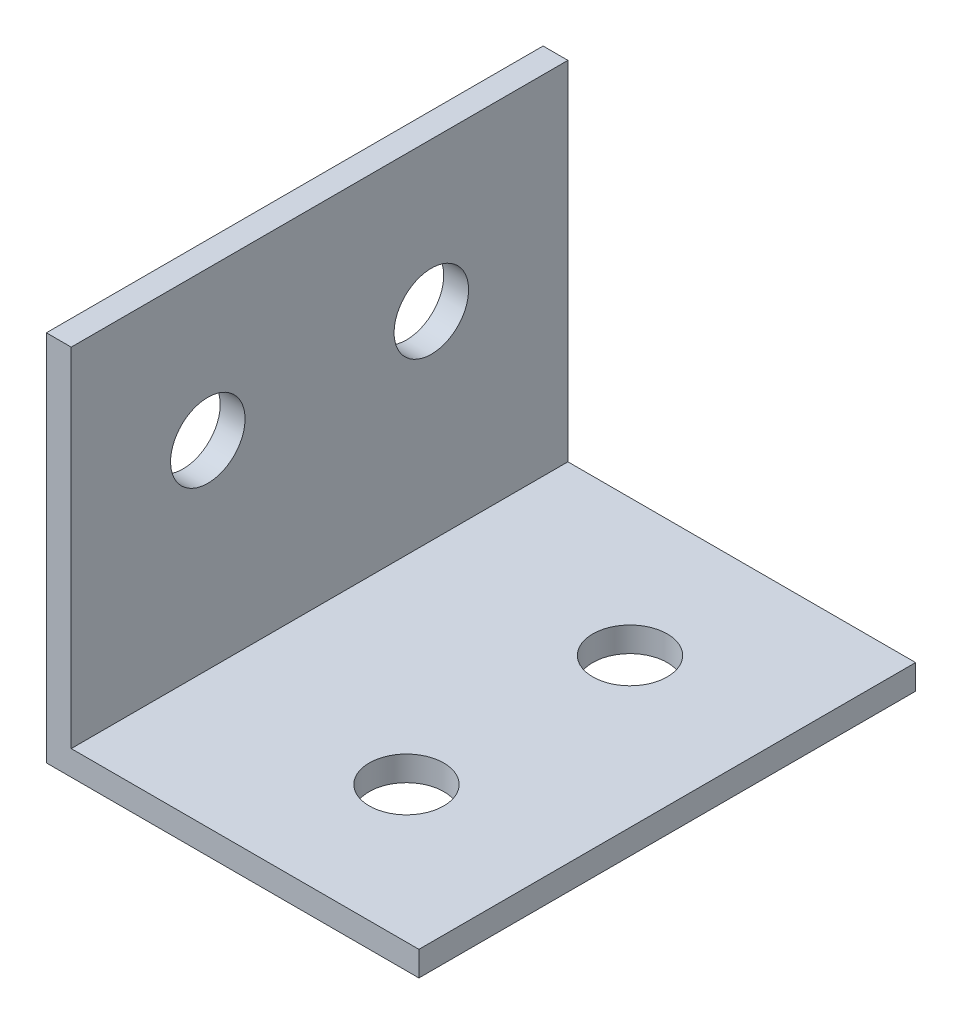
ISO-10303-21;
HEADER;
FILE_DESCRIPTION(('STEP AP214'),'2;1');
FILE_NAME('part.step','',(''),(''),'','','');
FILE_SCHEMA(('AUTOMOTIVE_DESIGN { 1 0 10303 214 1 1 1 1 }'));
ENDSEC;
DATA;
#1=APPLICATION_CONTEXT('core data for automotive mechanical design processes');
#2=APPLICATION_PROTOCOL_DEFINITION('international standard','automotive_design',2000,#1);
#3=PRODUCT_CONTEXT('',#1,'mechanical');
#4=PRODUCT('Part','Part','',(#3));
#5=PRODUCT_RELATED_PRODUCT_CATEGORY('part','',(#4));
#6=PRODUCT_DEFINITION_FORMATION('','',#4);
#7=PRODUCT_DEFINITION_CONTEXT('part definition',#1,'design');
#8=PRODUCT_DEFINITION('design','',#6,#7);
#9=PRODUCT_DEFINITION_SHAPE('','',#8);
#10=(LENGTH_UNIT() NAMED_UNIT(*) SI_UNIT(.MILLI.,.METRE.));
#11=(NAMED_UNIT(*) PLANE_ANGLE_UNIT() SI_UNIT($,.RADIAN.));
#12=(NAMED_UNIT(*) SI_UNIT($,.STERADIAN.) SOLID_ANGLE_UNIT());
#13=UNCERTAINTY_MEASURE_WITH_UNIT(LENGTH_MEASURE(1.E-05),#10,'distance_accuracy_value','');
#14=(GEOMETRIC_REPRESENTATION_CONTEXT(3) GLOBAL_UNCERTAINTY_ASSIGNED_CONTEXT((#13)) GLOBAL_UNIT_ASSIGNED_CONTEXT((#10,
#11,#12)) REPRESENTATION_CONTEXT('',''));
#15=CARTESIAN_POINT('',(0.,0.,0.));
#16=DIRECTION('',(0.,0.,1.));
#17=DIRECTION('',(1.,0.,0.));
#18=AXIS2_PLACEMENT_3D('',#15,#16,#17);
#19=CARTESIAN_POINT('',(14.,0.,20.));
#20=DIRECTION('',(0.,-1.,0.));
#21=DIRECTION('',(1.,0.,0.));
#22=AXIS2_PLACEMENT_3D('',#19,#20,#21);
#23=PLANE('',#22);
#24=CARTESIAN_POINT('',(8.00000000000001,0.,5.5));
#25=DIRECTION('',(0.,1.,0.));
#26=DIRECTION('',(-1.,0.,0.));
#27=AXIS2_PLACEMENT_3D('',#24,#25,#26);
#28=CIRCLE('',#27,1.5);
#29=CARTESIAN_POINT('',(6.50000000000001,0.,5.5));
#30=VERTEX_POINT('',#29);
#31=EDGE_CURVE('E183',#30,#30,#28,.T.);
#32=ORIENTED_EDGE('',*,*,#31,.F.);
#33=EDGE_LOOP('',(#32));
#34=FACE_BOUND('',#33,.T.);
#35=CARTESIAN_POINT('',(8.00000000000001,0.,14.5));
#36=DIRECTION('',(0.,1.,0.));
#37=DIRECTION('',(1.,0.,0.));
#38=AXIS2_PLACEMENT_3D('',#35,#36,#37);
#39=CIRCLE('',#38,1.5);
#40=CARTESIAN_POINT('',(9.5,0.,14.5));
#41=VERTEX_POINT('',#40);
#42=EDGE_CURVE('E186',#41,#41,#39,.T.);
#43=ORIENTED_EDGE('',*,*,#42,.F.);
#44=EDGE_LOOP('',(#43));
#45=FACE_BOUND('',#44,.T.);
#46=DIRECTION('',(-1.,0.,0.));
#47=VECTOR('',#46,1.);
#48=CARTESIAN_POINT('',(14.,0.,0.));
#49=LINE('',#48,#47);
#50=CARTESIAN_POINT('',(14.,0.,0.));
#51=VERTEX_POINT('',#50);
#52=CARTESIAN_POINT('',(0.,0.,0.));
#53=VERTEX_POINT('',#52);
#54=EDGE_CURVE('E128',#51,#53,#49,.T.);
#55=ORIENTED_EDGE('',*,*,#54,.T.);
#56=DIRECTION('',(0.,0.,-1.));
#57=VECTOR('',#56,1.);
#58=CARTESIAN_POINT('',(0.,0.,20.));
#59=LINE('',#58,#57);
#60=CARTESIAN_POINT('',(0.,0.,20.));
#61=VERTEX_POINT('',#60);
#62=EDGE_CURVE('E11',#61,#53,#59,.T.);
#63=ORIENTED_EDGE('',*,*,#62,.F.);
#64=DIRECTION('',(-1.,0.,0.));
#65=VECTOR('',#64,1.);
#66=CARTESIAN_POINT('',(14.,0.,20.));
#67=LINE('',#66,#65);
#68=CARTESIAN_POINT('',(14.,0.,20.));
#69=VERTEX_POINT('',#68);
#70=EDGE_CURVE('E145',#69,#61,#67,.T.);
#71=ORIENTED_EDGE('',*,*,#70,.F.);
#72=DIRECTION('',(0.,0.,-1.));
#73=VECTOR('',#72,1.);
#74=CARTESIAN_POINT('',(14.,0.,20.));
#75=LINE('',#74,#73);
#76=EDGE_CURVE('E124',#69,#51,#75,.T.);
#77=ORIENTED_EDGE('',*,*,#76,.T.);
#78=EDGE_LOOP('',(#55,#63,#71,#77));
#79=FACE_BOUND('',#78,.T.);
#80=ADVANCED_FACE('F39',(#34,#45,#79),#23,.F.);
#81=CARTESIAN_POINT('',(0.,0.,20.));
#82=DIRECTION('',(-1.,0.,0.));
#83=DIRECTION('',(0.,-1.,0.));
#84=AXIS2_PLACEMENT_3D('',#81,#82,#83);
#85=PLANE('',#84);
#86=CARTESIAN_POINT('',(0.,8.00000000000001,5.5));
#87=DIRECTION('',(-1.,0.,0.));
#88=DIRECTION('',(0.,-1.,0.));
#89=AXIS2_PLACEMENT_3D('',#86,#87,#88);
#90=CIRCLE('',#89,1.5);
#91=CARTESIAN_POINT('',(0.,6.50000000000001,5.5));
#92=VERTEX_POINT('',#91);
#93=EDGE_CURVE('E197',#92,#92,#90,.T.);
#94=ORIENTED_EDGE('',*,*,#93,.T.);
#95=EDGE_LOOP('',(#94));
#96=FACE_BOUND('',#95,.T.);
#97=CARTESIAN_POINT('',(0.,8.00000000000001,14.5));
#98=DIRECTION('',(-1.,0.,0.));
#99=DIRECTION('',(0.,1.,0.));
#100=AXIS2_PLACEMENT_3D('',#97,#98,#99);
#101=CIRCLE('',#100,1.5);
#102=CARTESIAN_POINT('',(0.,9.5,14.5));
#103=VERTEX_POINT('',#102);
#104=EDGE_CURVE('E211',#103,#103,#101,.T.);
#105=ORIENTED_EDGE('',*,*,#104,.T.);
#106=EDGE_LOOP('',(#105));
#107=FACE_BOUND('',#106,.T.);
#108=DIRECTION('',(0.,1.,0.));
#109=VECTOR('',#108,1.);
#110=CARTESIAN_POINT('',(0.,0.,0.));
#111=LINE('',#110,#109);
#112=CARTESIAN_POINT('',(0.,14.,0.));
#113=VERTEX_POINT('',#112);
#114=EDGE_CURVE('E132',#53,#113,#111,.T.);
#115=ORIENTED_EDGE('',*,*,#114,.T.);
#116=DIRECTION('',(0.,0.,-1.));
#117=VECTOR('',#116,1.);
#118=CARTESIAN_POINT('',(0.,14.,20.));
#119=LINE('',#118,#117);
#120=CARTESIAN_POINT('',(0.,14.,20.));
#121=VERTEX_POINT('',#120);
#122=EDGE_CURVE('E48',#121,#113,#119,.T.);
#123=ORIENTED_EDGE('',*,*,#122,.F.);
#124=DIRECTION('',(0.,1.,0.));
#125=VECTOR('',#124,1.);
#126=CARTESIAN_POINT('',(0.,0.,20.));
#127=LINE('',#126,#125);
#128=EDGE_CURVE('E93',#61,#121,#127,.T.);
#129=ORIENTED_EDGE('',*,*,#128,.F.);
#130=ORIENTED_EDGE('',*,*,#62,.T.);
#131=EDGE_LOOP('',(#115,#123,#129,#130));
#132=FACE_BOUND('',#131,.T.);
#133=ADVANCED_FACE('F174',(#96,#107,#132),#85,.F.);
#134=CARTESIAN_POINT('',(0.,14.,20.));
#135=DIRECTION('',(0.,-1.,0.));
#136=DIRECTION('',(1.,0.,0.));
#137=AXIS2_PLACEMENT_3D('',#134,#135,#136);
#138=PLANE('',#137);
#139=DIRECTION('',(-1.,0.,0.));
#140=VECTOR('',#139,1.);
#141=CARTESIAN_POINT('',(0.,14.,0.));
#142=LINE('',#141,#140);
#143=CARTESIAN_POINT('',(-0.999999999999999,14.,0.));
#144=VERTEX_POINT('',#143);
#145=EDGE_CURVE('E136',#113,#144,#142,.T.);
#146=ORIENTED_EDGE('',*,*,#145,.T.);
#147=DIRECTION('',(0.,0.,-1.));
#148=VECTOR('',#147,1.);
#149=CARTESIAN_POINT('',(-0.999999999999999,14.,20.));
#150=LINE('',#149,#148);
#151=CARTESIAN_POINT('',(-0.999999999999999,14.,20.));
#152=VERTEX_POINT('',#151);
#153=EDGE_CURVE('E117',#152,#144,#150,.T.);
#154=ORIENTED_EDGE('',*,*,#153,.F.);
#155=DIRECTION('',(-1.,0.,0.));
#156=VECTOR('',#155,1.);
#157=CARTESIAN_POINT('',(0.,14.,20.));
#158=LINE('',#157,#156);
#159=EDGE_CURVE('E106',#121,#152,#158,.T.);
#160=ORIENTED_EDGE('',*,*,#159,.F.);
#161=ORIENTED_EDGE('',*,*,#122,.T.);
#162=EDGE_LOOP('',(#146,#154,#160,#161));
#163=FACE_BOUND('',#162,.T.);
#164=ADVANCED_FACE('F155',(#163),#138,.F.);
#165=CARTESIAN_POINT('',(-0.999999999999999,14.,20.));
#166=DIRECTION('',(1.,0.,0.));
#167=DIRECTION('',(0.,1.,0.));
#168=AXIS2_PLACEMENT_3D('',#165,#166,#167);
#169=PLANE('',#168);
#170=CARTESIAN_POINT('',(-1.,8.00000000000001,5.5));
#171=DIRECTION('',(-1.,0.,0.));
#172=DIRECTION('',(0.,-1.,0.));
#173=AXIS2_PLACEMENT_3D('',#170,#171,#172);
#174=CIRCLE('',#173,1.5);
#175=CARTESIAN_POINT('',(-1.,6.50000000000001,5.5));
#176=VERTEX_POINT('',#175);
#177=EDGE_CURVE('E190',#176,#176,#174,.T.);
#178=ORIENTED_EDGE('',*,*,#177,.F.);
#179=EDGE_LOOP('',(#178));
#180=FACE_BOUND('',#179,.T.);
#181=CARTESIAN_POINT('',(-1.,8.00000000000001,14.5));
#182=DIRECTION('',(-1.,0.,0.));
#183=DIRECTION('',(0.,1.,0.));
#184=AXIS2_PLACEMENT_3D('',#181,#182,#183);
#185=CIRCLE('',#184,1.5);
#186=CARTESIAN_POINT('',(-1.,9.5,14.5));
#187=VERTEX_POINT('',#186);
#188=EDGE_CURVE('E215',#187,#187,#185,.T.);
#189=ORIENTED_EDGE('',*,*,#188,.F.);
#190=EDGE_LOOP('',(#189));
#191=FACE_BOUND('',#190,.T.);
#192=DIRECTION('',(0.,-1.,0.));
#193=VECTOR('',#192,1.);
#194=CARTESIAN_POINT('',(-0.999999999999999,14.,0.));
#195=LINE('',#194,#193);
#196=CARTESIAN_POINT('',(-1.,-0.999999999999998,0.));
#197=VERTEX_POINT('',#196);
#198=EDGE_CURVE('E115',#144,#197,#195,.T.);
#199=ORIENTED_EDGE('',*,*,#198,.T.);
#200=DIRECTION('',(0.,0.,-1.));
#201=VECTOR('',#200,1.);
#202=CARTESIAN_POINT('',(-1.,-0.999999999999998,20.));
#203=LINE('',#202,#201);
#204=CARTESIAN_POINT('',(-1.,-0.999999999999998,20.));
#205=VERTEX_POINT('',#204);
#206=EDGE_CURVE('E112',#205,#197,#203,.T.);
#207=ORIENTED_EDGE('',*,*,#206,.F.);
#208=DIRECTION('',(0.,-1.,0.));
#209=VECTOR('',#208,1.);
#210=CARTESIAN_POINT('',(-0.999999999999999,14.,20.));
#211=LINE('',#210,#209);
#212=EDGE_CURVE('E100',#152,#205,#211,.T.);
#213=ORIENTED_EDGE('',*,*,#212,.F.);
#214=ORIENTED_EDGE('',*,*,#153,.T.);
#215=EDGE_LOOP('',(#199,#207,#213,#214));
#216=FACE_BOUND('',#215,.T.);
#217=ADVANCED_FACE('F113',(#180,#191,#216),#169,.F.);
#218=CARTESIAN_POINT('',(-1.,-0.999999999999998,20.));
#219=DIRECTION('',(0.,1.,0.));
#220=DIRECTION('',(0.,0.,1.));
#221=AXIS2_PLACEMENT_3D('',#218,#219,#220);
#222=PLANE('',#221);
#223=CARTESIAN_POINT('',(8.00000000000001,-0.999999999999999,5.5));
#224=DIRECTION('',(0.,1.,0.));
#225=DIRECTION('',(-1.,0.,0.));
#226=AXIS2_PLACEMENT_3D('',#223,#224,#225);
#227=CIRCLE('',#226,1.5);
#228=CARTESIAN_POINT('',(6.50000000000001,-0.999999999999999,5.5));
#229=VERTEX_POINT('',#228);
#230=EDGE_CURVE('E133',#229,#229,#227,.T.);
#231=ORIENTED_EDGE('',*,*,#230,.T.);
#232=EDGE_LOOP('',(#231));
#233=FACE_BOUND('',#232,.T.);
#234=CARTESIAN_POINT('',(8.00000000000001,-0.999999999999999,14.5));
#235=DIRECTION('',(0.,1.,0.));
#236=DIRECTION('',(1.,0.,0.));
#237=AXIS2_PLACEMENT_3D('',#234,#235,#236);
#238=CIRCLE('',#237,1.5);
#239=CARTESIAN_POINT('',(9.5,-0.999999999999999,14.5));
#240=VERTEX_POINT('',#239);
#241=EDGE_CURVE('E189',#240,#240,#238,.T.);
#242=ORIENTED_EDGE('',*,*,#241,.T.);
#243=EDGE_LOOP('',(#242));
#244=FACE_BOUND('',#243,.T.);
#245=DIRECTION('',(1.,0.,0.));
#246=VECTOR('',#245,1.);
#247=CARTESIAN_POINT('',(-1.,-0.999999999999998,0.));
#248=LINE('',#247,#246);
#249=CARTESIAN_POINT('',(14.,-0.999999999999998,0.));
#250=VERTEX_POINT('',#249);
#251=EDGE_CURVE('E79',#197,#250,#248,.T.);
#252=ORIENTED_EDGE('',*,*,#251,.T.);
#253=DIRECTION('',(0.,0.,-1.));
#254=VECTOR('',#253,1.);
#255=CARTESIAN_POINT('',(14.,-0.999999999999998,20.));
#256=LINE('',#255,#254);
#257=CARTESIAN_POINT('',(14.,-0.999999999999998,20.));
#258=VERTEX_POINT('',#257);
#259=EDGE_CURVE('E118',#258,#250,#256,.T.);
#260=ORIENTED_EDGE('',*,*,#259,.F.);
#261=DIRECTION('',(1.,0.,0.));
#262=VECTOR('',#261,1.);
#263=CARTESIAN_POINT('',(-1.,-0.999999999999998,20.));
#264=LINE('',#263,#262);
#265=EDGE_CURVE('E104',#205,#258,#264,.T.);
#266=ORIENTED_EDGE('',*,*,#265,.F.);
#267=ORIENTED_EDGE('',*,*,#206,.T.);
#268=EDGE_LOOP('',(#252,#260,#266,#267));
#269=FACE_BOUND('',#268,.T.);
#270=ADVANCED_FACE('F120',(#233,#244,#269),#222,.F.);
#271=CARTESIAN_POINT('',(14.,-0.999999999999998,20.));
#272=DIRECTION('',(-1.,0.,0.));
#273=DIRECTION('',(0.,0.,1.));
#274=AXIS2_PLACEMENT_3D('',#271,#272,#273);
#275=PLANE('',#274);
#276=DIRECTION('',(0.,1.,0.));
#277=VECTOR('',#276,1.);
#278=CARTESIAN_POINT('',(14.,-0.999999999999998,0.));
#279=LINE('',#278,#277);
#280=EDGE_CURVE('E85',#250,#51,#279,.T.);
#281=ORIENTED_EDGE('',*,*,#280,.T.);
#282=ORIENTED_EDGE('',*,*,#76,.F.);
#283=DIRECTION('',(0.,1.,0.));
#284=VECTOR('',#283,1.);
#285=CARTESIAN_POINT('',(14.,-0.999999999999998,20.));
#286=LINE('',#285,#284);
#287=EDGE_CURVE('E56',#258,#69,#286,.T.);
#288=ORIENTED_EDGE('',*,*,#287,.F.);
#289=ORIENTED_EDGE('',*,*,#259,.T.);
#290=EDGE_LOOP('',(#281,#282,#288,#289));
#291=FACE_BOUND('',#290,.T.);
#292=ADVANCED_FACE('F162',(#291),#275,.F.);
#293=CARTESIAN_POINT('',(0.,0.,20.));
#294=DIRECTION('',(0.,0.,-1.));
#295=DIRECTION('',(-1.,0.,0.));
#296=AXIS2_PLACEMENT_3D('',#293,#294,#295);
#297=PLANE('',#296);
#298=ORIENTED_EDGE('',*,*,#70,.T.);
#299=ORIENTED_EDGE('',*,*,#128,.T.);
#300=ORIENTED_EDGE('',*,*,#159,.T.);
#301=ORIENTED_EDGE('',*,*,#212,.T.);
#302=ORIENTED_EDGE('',*,*,#265,.T.);
#303=ORIENTED_EDGE('',*,*,#287,.T.);
#304=EDGE_LOOP('',(#298,#299,#300,#301,#302,#303));
#305=FACE_BOUND('',#304,.T.);
#306=ADVANCED_FACE('F102',(#305),#297,.F.);
#307=CARTESIAN_POINT('',(0.,0.,0.));
#308=DIRECTION('',(0.,0.,-1.));
#309=DIRECTION('',(-1.,0.,0.));
#310=AXIS2_PLACEMENT_3D('',#307,#308,#309);
#311=PLANE('',#310);
#312=ORIENTED_EDGE('',*,*,#54,.F.);
#313=ORIENTED_EDGE('',*,*,#280,.F.);
#314=ORIENTED_EDGE('',*,*,#251,.F.);
#315=ORIENTED_EDGE('',*,*,#198,.F.);
#316=ORIENTED_EDGE('',*,*,#145,.F.);
#317=ORIENTED_EDGE('',*,*,#114,.F.);
#318=EDGE_LOOP('',(#312,#313,#314,#315,#316,#317));
#319=FACE_BOUND('',#318,.T.);
#320=ADVANCED_FACE('F158',(#319),#311,.T.);
#321=CARTESIAN_POINT('',(8.00000000000001,-0.999999999999999,14.5));
#322=DIRECTION('',(0.,1.,0.));
#323=DIRECTION('',(-1.,0.,0.));
#324=AXIS2_PLACEMENT_3D('',#321,#322,#323);
#325=CYLINDRICAL_SURFACE('',#324,1.5);
#326=ORIENTED_EDGE('',*,*,#241,.F.);
#327=EDGE_LOOP('',(#326));
#328=FACE_BOUND('',#327,.T.);
#329=ORIENTED_EDGE('',*,*,#42,.T.);
#330=EDGE_LOOP('',(#329));
#331=FACE_BOUND('',#330,.T.);
#332=ADVANCED_FACE('F238',(#328,#331),#325,.F.);
#333=CARTESIAN_POINT('',(8.00000000000001,-0.999999999999999,5.5));
#334=DIRECTION('',(0.,1.,0.));
#335=DIRECTION('',(-1.,0.,0.));
#336=AXIS2_PLACEMENT_3D('',#333,#334,#335);
#337=CYLINDRICAL_SURFACE('',#336,1.5);
#338=ORIENTED_EDGE('',*,*,#230,.F.);
#339=EDGE_LOOP('',(#338));
#340=FACE_BOUND('',#339,.T.);
#341=ORIENTED_EDGE('',*,*,#31,.T.);
#342=EDGE_LOOP('',(#341));
#343=FACE_BOUND('',#342,.T.);
#344=ADVANCED_FACE('F232',(#340,#343),#337,.F.);
#345=CARTESIAN_POINT('',(-1.,8.00000000000001,14.5));
#346=DIRECTION('',(1.,0.,0.));
#347=DIRECTION('',(0.,1.,0.));
#348=AXIS2_PLACEMENT_3D('',#345,#346,#347);
#349=CYLINDRICAL_SURFACE('',#348,1.5);
#350=ORIENTED_EDGE('',*,*,#188,.T.);
#351=EDGE_LOOP('',(#350));
#352=FACE_BOUND('',#351,.T.);
#353=ORIENTED_EDGE('',*,*,#104,.F.);
#354=EDGE_LOOP('',(#353));
#355=FACE_BOUND('',#354,.T.);
#356=ADVANCED_FACE('F226',(#352,#355),#349,.F.);
#357=CARTESIAN_POINT('',(-1.,8.00000000000001,5.5));
#358=DIRECTION('',(1.,0.,0.));
#359=DIRECTION('',(0.,1.,0.));
#360=AXIS2_PLACEMENT_3D('',#357,#358,#359);
#361=CYLINDRICAL_SURFACE('',#360,1.5);
#362=ORIENTED_EDGE('',*,*,#177,.T.);
#363=EDGE_LOOP('',(#362));
#364=FACE_BOUND('',#363,.T.);
#365=ORIENTED_EDGE('',*,*,#93,.F.);
#366=EDGE_LOOP('',(#365));
#367=FACE_BOUND('',#366,.T.);
#368=ADVANCED_FACE('F224',(#364,#367),#361,.F.);
#369=CLOSED_SHELL('',(#80,#133,#164,#217,#270,#292,#306,#320,#332,#344,#356,#368));
#370=MANIFOLD_SOLID_BREP('B2',#369);
#371=ADVANCED_BREP_SHAPE_REPRESENTATION('',(#18,#370),#14);
#372=SHAPE_DEFINITION_REPRESENTATION(#9,#371);
ENDSEC;
END-ISO-10303-21;
